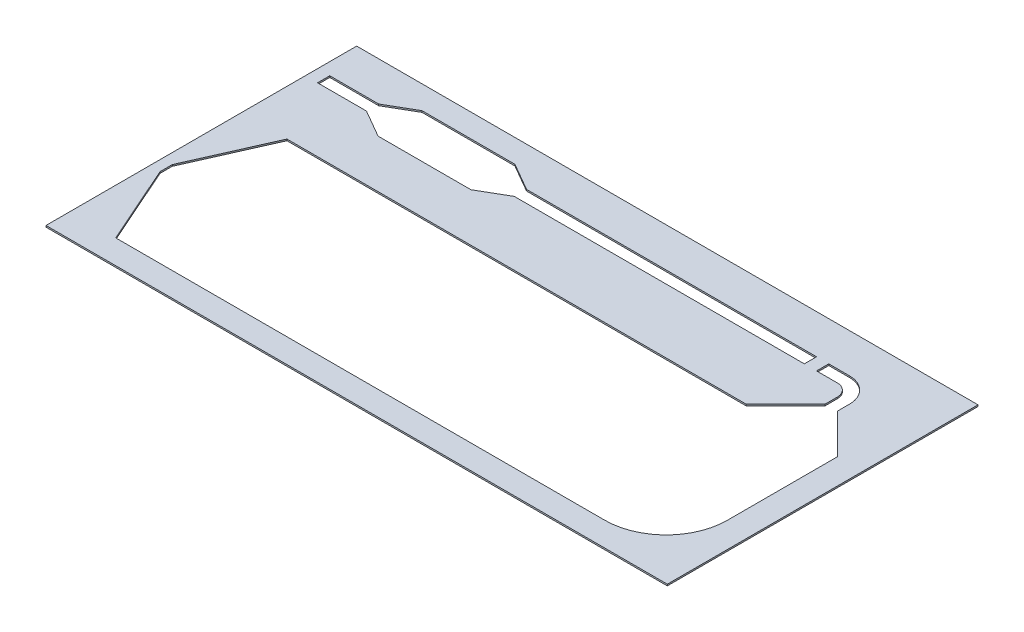
ISO-10303-21;
HEADER;
FILE_DESCRIPTION(('STEP AP214'),'2;1');
FILE_NAME('part.step','',(''),(''),'','','');
FILE_SCHEMA(('AUTOMOTIVE_DESIGN { 1 0 10303 214 1 1 1 1 }'));
ENDSEC;
DATA;
#1=APPLICATION_CONTEXT('core data for automotive mechanical design processes');
#2=APPLICATION_PROTOCOL_DEFINITION('international standard','automotive_design',2000,#1);
#3=PRODUCT_CONTEXT('',#1,'mechanical');
#4=PRODUCT('Part','Part','',(#3));
#5=PRODUCT_RELATED_PRODUCT_CATEGORY('part','',(#4));
#6=PRODUCT_DEFINITION_FORMATION('','',#4);
#7=PRODUCT_DEFINITION_CONTEXT('part definition',#1,'design');
#8=PRODUCT_DEFINITION('design','',#6,#7);
#9=PRODUCT_DEFINITION_SHAPE('','',#8);
#10=(LENGTH_UNIT() NAMED_UNIT(*) SI_UNIT(.MILLI.,.METRE.));
#11=(NAMED_UNIT(*) PLANE_ANGLE_UNIT() SI_UNIT($,.RADIAN.));
#12=(NAMED_UNIT(*) SI_UNIT($,.STERADIAN.) SOLID_ANGLE_UNIT());
#13=UNCERTAINTY_MEASURE_WITH_UNIT(LENGTH_MEASURE(1.E-05),#10,'distance_accuracy_value','');
#14=(GEOMETRIC_REPRESENTATION_CONTEXT(3) GLOBAL_UNCERTAINTY_ASSIGNED_CONTEXT((#13)) GLOBAL_UNIT_ASSIGNED_CONTEXT((#10,
#11,#12)) REPRESENTATION_CONTEXT('',''));
#15=CARTESIAN_POINT('',(0.,0.,0.));
#16=DIRECTION('',(0.,0.,1.));
#17=DIRECTION('',(1.,0.,0.));
#18=AXIS2_PLACEMENT_3D('',#15,#16,#17);
#19=CARTESIAN_POINT('',(77.9571332307417,-1.875,-8.49999999999999));
#20=DIRECTION('',(0.,0.,1.));
#21=DIRECTION('',(-1.,0.,0.));
#22=AXIS2_PLACEMENT_3D('',#19,#20,#21);
#23=PLANE('',#22);
#24=DIRECTION('',(1.,0.,0.));
#25=VECTOR('',#24,1.);
#26=CARTESIAN_POINT('',(86.2671332307417,0.,-8.49999999999999));
#27=LINE('',#26,#25);
#28=CARTESIAN_POINT('',(77.9571332307417,0.,-8.49999999999999));
#29=VERTEX_POINT('',#28);
#30=CARTESIAN_POINT('',(101.667133230742,0.,-8.5));
#31=VERTEX_POINT('',#30);
#32=EDGE_CURVE('E481',#29,#31,#27,.T.);
#33=ORIENTED_EDGE('',*,*,#32,.F.);
#34=DIRECTION('',(0.,1.,0.));
#35=VECTOR('',#34,1.);
#36=CARTESIAN_POINT('',(77.9571332307417,-1.875,-8.49999999999999));
#37=LINE('',#36,#35);
#38=CARTESIAN_POINT('',(77.9571332307417,0.125,-8.49999999999999));
#39=VERTEX_POINT('',#38);
#40=EDGE_CURVE('E363',#29,#39,#37,.T.);
#41=ORIENTED_EDGE('',*,*,#40,.T.);
#42=DIRECTION('',(-1.,0.,0.));
#43=VECTOR('',#42,1.);
#44=CARTESIAN_POINT('',(77.9571332307417,0.125,-8.49999999999999));
#45=LINE('',#44,#43);
#46=CARTESIAN_POINT('',(101.667133230742,0.125,-8.5));
#47=VERTEX_POINT('',#46);
#48=EDGE_CURVE('E329',#47,#39,#45,.T.);
#49=ORIENTED_EDGE('',*,*,#48,.F.);
#50=DIRECTION('',(0.,1.,0.));
#51=VECTOR('',#50,1.);
#52=CARTESIAN_POINT('',(101.667133230742,0.,-8.5));
#53=LINE('',#52,#51);
#54=EDGE_CURVE('E278',#31,#47,#53,.T.);
#55=ORIENTED_EDGE('',*,*,#54,.F.);
#56=EDGE_LOOP('',(#33,#41,#49,#55));
#57=FACE_BOUND('',#56,.T.);
#58=ADVANCED_FACE('F39',(#57),#23,.F.);
#59=CARTESIAN_POINT('',(77.9571332307417,-1.875,-9.5));
#60=DIRECTION('',(0.,0.,-1.));
#61=DIRECTION('',(1.,0.,0.));
#62=AXIS2_PLACEMENT_3D('',#59,#60,#61);
#63=PLANE('',#62);
#64=DIRECTION('',(1.,0.,0.));
#65=VECTOR('',#64,1.);
#66=CARTESIAN_POINT('',(77.9571332307417,0.125,-9.5));
#67=LINE('',#66,#65);
#68=CARTESIAN_POINT('',(77.9571332307417,0.125,-9.5));
#69=VERTEX_POINT('',#68);
#70=CARTESIAN_POINT('',(101.667133230742,0.125,-9.5));
#71=VERTEX_POINT('',#70);
#72=EDGE_CURVE('E264',#69,#71,#67,.T.);
#73=ORIENTED_EDGE('',*,*,#72,.F.);
#74=DIRECTION('',(0.,1.,0.));
#75=VECTOR('',#74,1.);
#76=CARTESIAN_POINT('',(77.9571332307417,-1.875,-9.5));
#77=LINE('',#76,#75);
#78=CARTESIAN_POINT('',(77.9571332307417,0.,-9.5));
#79=VERTEX_POINT('',#78);
#80=EDGE_CURVE('E393',#79,#69,#77,.T.);
#81=ORIENTED_EDGE('',*,*,#80,.F.);
#82=DIRECTION('',(-1.,0.,0.));
#83=VECTOR('',#82,1.);
#84=CARTESIAN_POINT('',(86.2671332307417,0.,-9.5));
#85=LINE('',#84,#83);
#86=CARTESIAN_POINT('',(101.667133230742,0.,-9.5));
#87=VERTEX_POINT('',#86);
#88=EDGE_CURVE('E438',#87,#79,#85,.T.);
#89=ORIENTED_EDGE('',*,*,#88,.F.);
#90=DIRECTION('',(0.,1.,0.));
#91=VECTOR('',#90,1.);
#92=CARTESIAN_POINT('',(101.667133230742,0.,-9.5));
#93=LINE('',#92,#91);
#94=EDGE_CURVE('E255',#87,#71,#93,.T.);
#95=ORIENTED_EDGE('',*,*,#94,.T.);
#96=EDGE_LOOP('',(#73,#81,#89,#95));
#97=FACE_BOUND('',#96,.T.);
#98=ADVANCED_FACE('F540',(#97),#63,.F.);
#99=CARTESIAN_POINT('',(111.667133230742,0.125,-12.7));
#100=DIRECTION('',(-1.,0.,0.));
#101=DIRECTION('',(0.,0.,-1.));
#102=AXIS2_PLACEMENT_3D('',#99,#100,#101);
#103=PLANE('',#102);
#104=DIRECTION('',(0.,0.,1.));
#105=VECTOR('',#104,1.);
#106=CARTESIAN_POINT('',(111.667133230742,0.,-12.7));
#107=LINE('',#106,#105);
#108=CARTESIAN_POINT('',(111.667133230742,0.,-12.7));
#109=VERTEX_POINT('',#108);
#110=CARTESIAN_POINT('',(111.667133230742,0.,12.7));
#111=VERTEX_POINT('',#110);
#112=EDGE_CURVE('E352',#109,#111,#107,.T.);
#113=ORIENTED_EDGE('',*,*,#112,.F.);
#114=DIRECTION('',(0.,-1.,0.));
#115=VECTOR('',#114,1.);
#116=CARTESIAN_POINT('',(111.667133230742,0.125,-12.7));
#117=LINE('',#116,#115);
#118=CARTESIAN_POINT('',(111.667133230742,0.125,-12.7));
#119=VERTEX_POINT('',#118);
#120=EDGE_CURVE('E411',#119,#109,#117,.T.);
#121=ORIENTED_EDGE('',*,*,#120,.F.);
#122=DIRECTION('',(0.,0.,1.));
#123=VECTOR('',#122,1.);
#124=CARTESIAN_POINT('',(111.667133230742,0.125,-12.7));
#125=LINE('',#124,#123);
#126=CARTESIAN_POINT('',(111.667133230742,0.125,12.7));
#127=VERTEX_POINT('',#126);
#128=EDGE_CURVE('E399',#119,#127,#125,.T.);
#129=ORIENTED_EDGE('',*,*,#128,.T.);
#130=DIRECTION('',(0.,-1.,0.));
#131=VECTOR('',#130,1.);
#132=CARTESIAN_POINT('',(111.667133230742,0.125,12.7));
#133=LINE('',#132,#131);
#134=EDGE_CURVE('E429',#127,#111,#133,.T.);
#135=ORIENTED_EDGE('',*,*,#134,.T.);
#136=EDGE_LOOP('',(#113,#121,#129,#135));
#137=FACE_BOUND('',#136,.T.);
#138=ADVANCED_FACE('F41',(#137),#103,.F.);
#139=CARTESIAN_POINT('',(60.8671332307417,0.125,12.7));
#140=DIRECTION('',(0.,0.,-1.));
#141=DIRECTION('',(1.,0.,0.));
#142=AXIS2_PLACEMENT_3D('',#139,#140,#141);
#143=PLANE('',#142);
#144=DIRECTION('',(-1.,0.,0.));
#145=VECTOR('',#144,1.);
#146=CARTESIAN_POINT('',(60.8671332307417,0.,12.7));
#147=LINE('',#146,#145);
#148=CARTESIAN_POINT('',(60.8671332307417,0.,12.7));
#149=VERTEX_POINT('',#148);
#150=EDGE_CURVE('E414',#111,#149,#147,.T.);
#151=ORIENTED_EDGE('',*,*,#150,.F.);
#152=ORIENTED_EDGE('',*,*,#134,.F.);
#153=DIRECTION('',(-1.,0.,0.));
#154=VECTOR('',#153,1.);
#155=CARTESIAN_POINT('',(60.8671332307417,0.125,12.7));
#156=LINE('',#155,#154);
#157=CARTESIAN_POINT('',(60.8671332307417,0.125,12.7));
#158=VERTEX_POINT('',#157);
#159=EDGE_CURVE('E402',#127,#158,#156,.T.);
#160=ORIENTED_EDGE('',*,*,#159,.T.);
#161=DIRECTION('',(0.,-1.,0.));
#162=VECTOR('',#161,1.);
#163=CARTESIAN_POINT('',(60.8671332307417,0.125,12.7));
#164=LINE('',#163,#162);
#165=EDGE_CURVE('E426',#158,#149,#164,.T.);
#166=ORIENTED_EDGE('',*,*,#165,.T.);
#167=EDGE_LOOP('',(#151,#152,#160,#166));
#168=FACE_BOUND('',#167,.T.);
#169=ADVANCED_FACE('F853',(#168),#143,.F.);
#170=CARTESIAN_POINT('',(60.8671332307417,0.125,-12.7));
#171=DIRECTION('',(1.,0.,0.));
#172=DIRECTION('',(0.,0.,1.));
#173=AXIS2_PLACEMENT_3D('',#170,#171,#172);
#174=PLANE('',#173);
#175=DIRECTION('',(0.,0.,-1.));
#176=VECTOR('',#175,1.);
#177=CARTESIAN_POINT('',(60.8671332307417,0.,-12.7));
#178=LINE('',#177,#176);
#179=CARTESIAN_POINT('',(60.8671332307417,0.,-12.7));
#180=VERTEX_POINT('',#179);
#181=EDGE_CURVE('E417',#149,#180,#178,.T.);
#182=ORIENTED_EDGE('',*,*,#181,.F.);
#183=ORIENTED_EDGE('',*,*,#165,.F.);
#184=DIRECTION('',(0.,0.,-1.));
#185=VECTOR('',#184,1.);
#186=CARTESIAN_POINT('',(60.8671332307417,0.125,-12.7));
#187=LINE('',#186,#185);
#188=CARTESIAN_POINT('',(60.8671332307417,0.125,-12.7));
#189=VERTEX_POINT('',#188);
#190=EDGE_CURVE('E406',#158,#189,#187,.T.);
#191=ORIENTED_EDGE('',*,*,#190,.T.);
#192=DIRECTION('',(0.,-1.,0.));
#193=VECTOR('',#192,1.);
#194=CARTESIAN_POINT('',(60.8671332307417,0.125,-12.7));
#195=LINE('',#194,#193);
#196=EDGE_CURVE('E423',#189,#180,#195,.T.);
#197=ORIENTED_EDGE('',*,*,#196,.T.);
#198=EDGE_LOOP('',(#182,#183,#191,#197));
#199=FACE_BOUND('',#198,.T.);
#200=ADVANCED_FACE('F559',(#199),#174,.F.);
#201=CARTESIAN_POINT('',(60.8671332307417,0.125,-12.7));
#202=DIRECTION('',(0.,0.,1.));
#203=DIRECTION('',(-1.,0.,0.));
#204=AXIS2_PLACEMENT_3D('',#201,#202,#203);
#205=PLANE('',#204);
#206=DIRECTION('',(1.,0.,0.));
#207=VECTOR('',#206,1.);
#208=CARTESIAN_POINT('',(60.8671332307417,0.,-12.7));
#209=LINE('',#208,#207);
#210=EDGE_CURVE('E403',#180,#109,#209,.T.);
#211=ORIENTED_EDGE('',*,*,#210,.F.);
#212=ORIENTED_EDGE('',*,*,#196,.F.);
#213=DIRECTION('',(1.,0.,0.));
#214=VECTOR('',#213,1.);
#215=CARTESIAN_POINT('',(60.8671332307417,0.125,-12.7));
#216=LINE('',#215,#214);
#217=EDGE_CURVE('E409',#189,#119,#216,.T.);
#218=ORIENTED_EDGE('',*,*,#217,.T.);
#219=ORIENTED_EDGE('',*,*,#120,.T.);
#220=EDGE_LOOP('',(#211,#212,#218,#219));
#221=FACE_BOUND('',#220,.T.);
#222=ADVANCED_FACE('F552',(#221),#205,.F.);
#223=CARTESIAN_POINT('',(86.2671332307417,0.125,0.));
#224=DIRECTION('',(0.,-1.,0.));
#225=DIRECTION('',(0.,0.,-1.));
#226=AXIS2_PLACEMENT_3D('',#223,#224,#225);
#227=PLANE('',#226);
#228=ORIENTED_EDGE('',*,*,#48,.T.);
#229=DIRECTION('',(-0.865865073244552,0.,0.500277597874626));
#230=VECTOR('',#229,1.);
#231=CARTESIAN_POINT('',(75.7071332307417,0.125,-7.19999999999999));
#232=LINE('',#231,#230);
#233=CARTESIAN_POINT('',(75.7071332307417,0.125,-7.19999999999999));
#234=VERTEX_POINT('',#233);
#235=EDGE_CURVE('E331',#39,#234,#232,.T.);
#236=ORIENTED_EDGE('',*,*,#235,.T.);
#237=DIRECTION('',(-1.,0.,0.));
#238=VECTOR('',#237,1.);
#239=CARTESIAN_POINT('',(68.1171332307417,0.125,-7.2));
#240=LINE('',#239,#238);
#241=CARTESIAN_POINT('',(68.1171332307417,0.125,-7.2));
#242=VERTEX_POINT('',#241);
#243=EDGE_CURVE('E334',#234,#242,#240,.T.);
#244=ORIENTED_EDGE('',*,*,#243,.T.);
#245=DIRECTION('',(-0.865865073244551,0.,-0.500277597874628));
#246=VECTOR('',#245,1.);
#247=CARTESIAN_POINT('',(68.1171332307417,0.125,-7.2));
#248=LINE('',#247,#246);
#249=CARTESIAN_POINT('',(65.8671332307417,0.125,-8.49999999999999));
#250=VERTEX_POINT('',#249);
#251=EDGE_CURVE('E337',#242,#250,#248,.T.);
#252=ORIENTED_EDGE('',*,*,#251,.T.);
#253=DIRECTION('',(-1.,0.,0.));
#254=VECTOR('',#253,1.);
#255=CARTESIAN_POINT('',(65.8671332307417,0.125,-8.49999999999999));
#256=LINE('',#255,#254);
#257=CARTESIAN_POINT('',(61.8671332307417,0.125,-8.49999999999999));
#258=VERTEX_POINT('',#257);
#259=EDGE_CURVE('E340',#250,#258,#256,.T.);
#260=ORIENTED_EDGE('',*,*,#259,.T.);
#261=DIRECTION('',(0.,0.,-1.));
#262=VECTOR('',#261,1.);
#263=CARTESIAN_POINT('',(61.8671332307417,0.125,-9.49999999999999));
#264=LINE('',#263,#262);
#265=CARTESIAN_POINT('',(61.8671332307417,0.125,-9.49999999999999));
#266=VERTEX_POINT('',#265);
#267=EDGE_CURVE('E343',#258,#266,#264,.T.);
#268=ORIENTED_EDGE('',*,*,#267,.T.);
#269=DIRECTION('',(1.,0.,0.));
#270=VECTOR('',#269,1.);
#271=CARTESIAN_POINT('',(65.8671332307417,0.125,-9.49999999999999));
#272=LINE('',#271,#270);
#273=CARTESIAN_POINT('',(65.8671332307417,0.125,-9.49999999999999));
#274=VERTEX_POINT('',#273);
#275=EDGE_CURVE('E346',#266,#274,#272,.T.);
#276=ORIENTED_EDGE('',*,*,#275,.T.);
#277=DIRECTION('',(0.86586507324455,0.,-0.50027759787463));
#278=VECTOR('',#277,1.);
#279=CARTESIAN_POINT('',(68.1171332307417,0.125,-10.8));
#280=LINE('',#279,#278);
#281=CARTESIAN_POINT('',(68.1171332307417,0.125,-10.8));
#282=VERTEX_POINT('',#281);
#283=EDGE_CURVE('E281',#274,#282,#280,.T.);
#284=ORIENTED_EDGE('',*,*,#283,.T.);
#285=DIRECTION('',(1.,0.,0.));
#286=VECTOR('',#285,1.);
#287=CARTESIAN_POINT('',(68.1171332307417,0.125,-10.8));
#288=LINE('',#287,#286);
#289=CARTESIAN_POINT('',(75.7071332307417,0.125,-10.8));
#290=VERTEX_POINT('',#289);
#291=EDGE_CURVE('E287',#282,#290,#288,.T.);
#292=ORIENTED_EDGE('',*,*,#291,.T.);
#293=DIRECTION('',(0.865865073244553,0.,0.500277597874625));
#294=VECTOR('',#293,1.);
#295=CARTESIAN_POINT('',(75.7071332307417,0.125,-10.8));
#296=LINE('',#295,#294);
#297=EDGE_CURVE('E265',#290,#69,#296,.T.);
#298=ORIENTED_EDGE('',*,*,#297,.T.);
#299=ORIENTED_EDGE('',*,*,#72,.T.);
#300=DIRECTION('',(0.,0.,-1.));
#301=VECTOR('',#300,1.);
#302=CARTESIAN_POINT('',(101.667133230742,0.125,-9.5));
#303=LINE('',#302,#301);
#304=EDGE_CURVE('E272',#47,#71,#303,.T.);
#305=ORIENTED_EDGE('',*,*,#304,.F.);
#306=EDGE_LOOP('',(#228,#236,#244,#252,#260,#268,#276,#284,#292,#298,#299,#305));
#307=FACE_BOUND('',#306,.T.);
#308=DIRECTION('',(0.,0.,1.));
#309=VECTOR('',#308,1.);
#310=CARTESIAN_POINT('',(102.667133230742,0.125,-9.5));
#311=LINE('',#310,#309);
#312=CARTESIAN_POINT('',(102.667133230742,0.125,-9.5));
#313=VERTEX_POINT('',#312);
#314=CARTESIAN_POINT('',(102.667133230742,0.125,-8.5));
#315=VERTEX_POINT('',#314);
#316=EDGE_CURVE('E250',#313,#315,#311,.T.);
#317=ORIENTED_EDGE('',*,*,#316,.F.);
#318=CARTESIAN_POINT('',(104.367133230742,0.125,-9.5));
#319=VERTEX_POINT('',#318);
#320=EDGE_CURVE('E258',#313,#319,#67,.T.);
#321=ORIENTED_EDGE('',*,*,#320,.T.);
#322=CARTESIAN_POINT('',(104.367133230742,0.125,-7.5));
#323=DIRECTION('',(0.,-1.,0.));
#324=DIRECTION('',(0.,0.,1.));
#325=AXIS2_PLACEMENT_3D('',#322,#323,#324);
#326=CIRCLE('',#325,2.);
#327=CARTESIAN_POINT('',(106.367133230742,0.125,-7.49999999999998));
#328=VERTEX_POINT('',#327);
#329=EDGE_CURVE('E292',#319,#328,#326,.T.);
#330=ORIENTED_EDGE('',*,*,#329,.T.);
#331=DIRECTION('',(0.,0.,1.));
#332=VECTOR('',#331,1.);
#333=CARTESIAN_POINT('',(106.367133230742,0.125,-7.49999999999998));
#334=LINE('',#333,#332);
#335=CARTESIAN_POINT('',(106.367133230742,0.125,-6.5));
#336=VERTEX_POINT('',#335);
#337=EDGE_CURVE('E294',#328,#336,#334,.T.);
#338=ORIENTED_EDGE('',*,*,#337,.T.);
#339=DIRECTION('',(0.707106781186547,0.,0.707106781186548));
#340=VECTOR('',#339,1.);
#341=CARTESIAN_POINT('',(106.367133230742,0.125,-6.5));
#342=LINE('',#341,#340);
#343=CARTESIAN_POINT('',(109.597413718749,0.125,-3.26971951199276));
#344=VERTEX_POINT('',#343);
#345=EDGE_CURVE('E297',#336,#344,#342,.T.);
#346=ORIENTED_EDGE('',*,*,#345,.T.);
#347=DIRECTION('',(0.,0.,1.));
#348=VECTOR('',#347,1.);
#349=CARTESIAN_POINT('',(109.597413718749,0.125,-3.26971951199276));
#350=LINE('',#349,#348);
#351=CARTESIAN_POINT('',(109.597413718749,0.125,5.7302804880072));
#352=VERTEX_POINT('',#351);
#353=EDGE_CURVE('E300',#344,#352,#350,.T.);
#354=ORIENTED_EDGE('',*,*,#353,.T.);
#355=CARTESIAN_POINT('',(104.597413718749,0.125,5.73028048800724));
#356=DIRECTION('',(0.,-1.,0.));
#357=DIRECTION('',(0.,0.,-1.));
#358=AXIS2_PLACEMENT_3D('',#355,#356,#357);
#359=CIRCLE('',#358,5.);
#360=CARTESIAN_POINT('',(104.597413718749,0.125,10.7302804880072));
#361=VERTEX_POINT('',#360);
#362=EDGE_CURVE('E303',#352,#361,#359,.T.);
#363=ORIENTED_EDGE('',*,*,#362,.T.);
#364=DIRECTION('',(-1.,0.,0.));
#365=VECTOR('',#364,1.);
#366=CARTESIAN_POINT('',(104.597413718749,0.125,10.7302804880072));
#367=LINE('',#366,#365);
#368=CARTESIAN_POINT('',(64.597413718749,0.125,10.7302804880072));
#369=VERTEX_POINT('',#368);
#370=EDGE_CURVE('E306',#361,#369,#367,.T.);
#371=ORIENTED_EDGE('',*,*,#370,.T.);
#372=DIRECTION('',(-0.404797287724746,0.,-0.914406450026841));
#373=VECTOR('',#372,1.);
#374=CARTESIAN_POINT('',(64.597413718749,0.125,10.7302804880072));
#375=LINE('',#374,#373);
#376=CARTESIAN_POINT('',(61.7199379855741,0.125,4.23028048800724));
#377=VERTEX_POINT('',#376);
#378=EDGE_CURVE('E309',#369,#377,#375,.T.);
#379=ORIENTED_EDGE('',*,*,#378,.T.);
#380=DIRECTION('',(0.,0.,-1.));
#381=VECTOR('',#380,1.);
#382=CARTESIAN_POINT('',(61.7199379855741,0.125,4.23028048800724));
#383=LINE('',#382,#381);
#384=CARTESIAN_POINT('',(61.7199379855741,0.125,3.23028048800733));
#385=VERTEX_POINT('',#384);
#386=EDGE_CURVE('E312',#377,#385,#383,.T.);
#387=ORIENTED_EDGE('',*,*,#386,.T.);
#388=DIRECTION('',(0.404797287724746,0.,-0.914406450026841));
#389=VECTOR('',#388,1.);
#390=CARTESIAN_POINT('',(64.597413718749,0.125,-3.26971951199267));
#391=LINE('',#390,#389);
#392=CARTESIAN_POINT('',(64.597413718749,0.125,-3.26971951199267));
#393=VERTEX_POINT('',#392);
#394=EDGE_CURVE('E315',#385,#393,#391,.T.);
#395=ORIENTED_EDGE('',*,*,#394,.T.);
#396=DIRECTION('',(1.,0.,0.));
#397=VECTOR('',#396,1.);
#398=CARTESIAN_POINT('',(102.136852742734,0.125,-3.26971951199267));
#399=LINE('',#398,#397);
#400=CARTESIAN_POINT('',(102.136852742734,0.125,-3.26971951199267));
#401=VERTEX_POINT('',#400);
#402=EDGE_CURVE('E318',#393,#401,#399,.T.);
#403=ORIENTED_EDGE('',*,*,#402,.T.);
#404=DIRECTION('',(0.707106781186547,0.,-0.707106781186547));
#405=VECTOR('',#404,1.);
#406=CARTESIAN_POINT('',(105.367133230742,0.125,-6.5));
#407=LINE('',#406,#405);
#408=CARTESIAN_POINT('',(105.367133230742,0.125,-6.5));
#409=VERTEX_POINT('',#408);
#410=EDGE_CURVE('E321',#401,#409,#407,.T.);
#411=ORIENTED_EDGE('',*,*,#410,.T.);
#412=DIRECTION('',(0.,0.,-1.));
#413=VECTOR('',#412,1.);
#414=CARTESIAN_POINT('',(105.367133230742,0.125,-7.49999999999999));
#415=LINE('',#414,#413);
#416=CARTESIAN_POINT('',(105.367133230742,0.125,-7.49999999999999));
#417=VERTEX_POINT('',#416);
#418=EDGE_CURVE('E324',#409,#417,#415,.T.);
#419=ORIENTED_EDGE('',*,*,#418,.T.);
#420=CARTESIAN_POINT('',(104.367133230742,0.125,-7.5));
#421=DIRECTION('',(0.,1.,0.));
#422=DIRECTION('',(0.,0.,1.));
#423=AXIS2_PLACEMENT_3D('',#420,#421,#422);
#424=CIRCLE('',#423,0.999999999999999);
#425=CARTESIAN_POINT('',(104.367133230742,0.125,-8.5));
#426=VERTEX_POINT('',#425);
#427=EDGE_CURVE('E327',#417,#426,#424,.T.);
#428=ORIENTED_EDGE('',*,*,#427,.T.);
#429=EDGE_CURVE('E270',#426,#315,#45,.T.);
#430=ORIENTED_EDGE('',*,*,#429,.T.);
#431=EDGE_LOOP('',(#317,#321,#330,#338,#346,#354,#363,#371,#379,#387,#395,#403,#411,#419,#428,#430));
#432=FACE_BOUND('',#431,.T.);
#433=ORIENTED_EDGE('',*,*,#128,.F.);
#434=ORIENTED_EDGE('',*,*,#217,.F.);
#435=ORIENTED_EDGE('',*,*,#190,.F.);
#436=ORIENTED_EDGE('',*,*,#159,.F.);
#437=EDGE_LOOP('',(#433,#434,#435,#436));
#438=FACE_BOUND('',#437,.T.);
#439=ADVANCED_FACE('F267',(#307,#432,#438),#227,.F.);
#440=CARTESIAN_POINT('',(86.2671332307417,0.,0.));
#441=DIRECTION('',(0.,-1.,0.));
#442=DIRECTION('',(0.,0.,-1.));
#443=AXIS2_PLACEMENT_3D('',#440,#441,#442);
#444=PLANE('',#443);
#445=DIRECTION('',(0.,0.,-1.));
#446=VECTOR('',#445,1.);
#447=CARTESIAN_POINT('',(101.667133230742,0.,-9.5));
#448=LINE('',#447,#446);
#449=EDGE_CURVE('E271',#31,#87,#448,.T.);
#450=ORIENTED_EDGE('',*,*,#449,.T.);
#451=ORIENTED_EDGE('',*,*,#88,.T.);
#452=DIRECTION('',(-0.865865073244553,0.,-0.500277597874626));
#453=VECTOR('',#452,1.);
#454=CARTESIAN_POINT('',(88.3024682918302,0.,-3.52269529803782));
#455=LINE('',#454,#453);
#456=CARTESIAN_POINT('',(75.7071332307417,0.,-10.8));
#457=VERTEX_POINT('',#456);
#458=EDGE_CURVE('E435',#79,#457,#455,.T.);
#459=ORIENTED_EDGE('',*,*,#458,.T.);
#460=DIRECTION('',(-1.,0.,0.));
#461=VECTOR('',#460,1.);
#462=CARTESIAN_POINT('',(86.2671332307417,0.,-10.8));
#463=LINE('',#462,#461);
#464=CARTESIAN_POINT('',(68.1171332307417,0.,-10.8));
#465=VERTEX_POINT('',#464);
#466=EDGE_CURVE('E432',#457,#465,#463,.T.);
#467=ORIENTED_EDGE('',*,*,#466,.T.);
#468=DIRECTION('',(-0.86586507324455,0.,0.50027759787463));
#469=VECTOR('',#468,1.);
#470=CARTESIAN_POINT('',(77.0463261222634,0.,-15.9590892262125));
#471=LINE('',#470,#469);
#472=CARTESIAN_POINT('',(65.8671332307417,0.,-9.49999999999999));
#473=VERTEX_POINT('',#472);
#474=EDGE_CURVE('E11',#465,#473,#471,.T.);
#475=ORIENTED_EDGE('',*,*,#474,.T.);
#476=DIRECTION('',(-1.,0.,0.));
#477=VECTOR('',#476,1.);
#478=CARTESIAN_POINT('',(86.2671332307417,0.,-9.49999999999999));
#479=LINE('',#478,#477);
#480=CARTESIAN_POINT('',(61.8671332307417,0.,-9.49999999999999));
#481=VERTEX_POINT('',#480);
#482=EDGE_CURVE('E47',#473,#481,#479,.T.);
#483=ORIENTED_EDGE('',*,*,#482,.T.);
#484=DIRECTION('',(0.,0.,1.));
#485=VECTOR('',#484,1.);
#486=CARTESIAN_POINT('',(61.8671332307417,0.,0.));
#487=LINE('',#486,#485);
#488=CARTESIAN_POINT('',(61.8671332307417,0.,-8.49999999999999));
#489=VERTEX_POINT('',#488);
#490=EDGE_CURVE('E495',#481,#489,#487,.T.);
#491=ORIENTED_EDGE('',*,*,#490,.T.);
#492=DIRECTION('',(1.,0.,0.));
#493=VECTOR('',#492,1.);
#494=CARTESIAN_POINT('',(86.2671332307417,0.,-8.49999999999998));
#495=LINE('',#494,#493);
#496=CARTESIAN_POINT('',(65.8671332307417,0.,-8.49999999999999));
#497=VERTEX_POINT('',#496);
#498=EDGE_CURVE('E492',#489,#497,#495,.T.);
#499=ORIENTED_EDGE('',*,*,#498,.T.);
#500=DIRECTION('',(0.865865073244551,0.,0.500277597874628));
#501=VECTOR('',#500,1.);
#502=CARTESIAN_POINT('',(84.8434383029372,0.,2.46408737504627));
#503=LINE('',#502,#501);
#504=CARTESIAN_POINT('',(68.1171332307417,0.,-7.2));
#505=VERTEX_POINT('',#504);
#506=EDGE_CURVE('E489',#497,#505,#503,.T.);
#507=ORIENTED_EDGE('',*,*,#506,.T.);
#508=DIRECTION('',(1.,0.,0.));
#509=VECTOR('',#508,1.);
#510=CARTESIAN_POINT('',(86.2671332307417,0.,-7.19999999999999));
#511=LINE('',#510,#509);
#512=CARTESIAN_POINT('',(75.7071332307417,0.,-7.19999999999999));
#513=VERTEX_POINT('',#512);
#514=EDGE_CURVE('E486',#505,#513,#511,.T.);
#515=ORIENTED_EDGE('',*,*,#514,.T.);
#516=DIRECTION('',(0.865865073244552,0.,-0.500277597874626));
#517=VECTOR('',#516,1.);
#518=CARTESIAN_POINT('',(80.5053561111564,0.,-9.97230655312847));
#519=LINE('',#518,#517);
#520=EDGE_CURVE('E484',#513,#29,#519,.T.);
#521=ORIENTED_EDGE('',*,*,#520,.T.);
#522=ORIENTED_EDGE('',*,*,#32,.T.);
#523=EDGE_LOOP('',(#450,#451,#459,#467,#475,#483,#491,#499,#507,#515,#521,#522));
#524=FACE_BOUND('',#523,.T.);
#525=CARTESIAN_POINT('',(102.667133230742,0.,-8.5));
#526=VERTEX_POINT('',#525);
#527=CARTESIAN_POINT('',(104.367133230742,0.,-8.5));
#528=VERTEX_POINT('',#527);
#529=EDGE_CURVE('E480',#526,#528,#27,.T.);
#530=ORIENTED_EDGE('',*,*,#529,.T.);
#531=CARTESIAN_POINT('',(104.367133230742,0.,-7.5));
#532=DIRECTION('',(0.,1.,0.));
#533=DIRECTION('',(0.,0.,-1.));
#534=AXIS2_PLACEMENT_3D('',#531,#532,#533);
#535=CIRCLE('',#534,0.999999999999999);
#536=CARTESIAN_POINT('',(105.367133230742,0.,-7.49999999999999));
#537=VERTEX_POINT('',#536);
#538=EDGE_CURVE('E477',#528,#537,#535,.F.);
#539=ORIENTED_EDGE('',*,*,#538,.T.);
#540=DIRECTION('',(0.,0.,1.));
#541=VECTOR('',#540,1.);
#542=CARTESIAN_POINT('',(105.367133230742,0.,0.));
#543=LINE('',#542,#541);
#544=CARTESIAN_POINT('',(105.367133230742,0.,-6.5));
#545=VERTEX_POINT('',#544);
#546=EDGE_CURVE('E474',#537,#545,#543,.T.);
#547=ORIENTED_EDGE('',*,*,#546,.T.);
#548=DIRECTION('',(-0.707106781186548,0.,0.707106781186548));
#549=VECTOR('',#548,1.);
#550=CARTESIAN_POINT('',(92.5671332307417,0.,6.3));
#551=LINE('',#550,#549);
#552=CARTESIAN_POINT('',(102.136852742734,0.,-3.26971951199267));
#553=VERTEX_POINT('',#552);
#554=EDGE_CURVE('E471',#545,#553,#551,.T.);
#555=ORIENTED_EDGE('',*,*,#554,.T.);
#556=DIRECTION('',(-1.,0.,0.));
#557=VECTOR('',#556,1.);
#558=CARTESIAN_POINT('',(86.2671332307417,0.,-3.26971951199267));
#559=LINE('',#558,#557);
#560=CARTESIAN_POINT('',(64.597413718749,0.,-3.26971951199267));
#561=VERTEX_POINT('',#560);
#562=EDGE_CURVE('E468',#553,#561,#559,.T.);
#563=ORIENTED_EDGE('',*,*,#562,.T.);
#564=DIRECTION('',(-0.404797287724746,0.,0.914406450026841));
#565=VECTOR('',#564,1.);
#566=CARTESIAN_POINT('',(66.9379480226128,0.,-8.55680944283604));
#567=LINE('',#566,#565);
#568=CARTESIAN_POINT('',(61.7199379855741,0.,3.23028048800733));
#569=VERTEX_POINT('',#568);
#570=EDGE_CURVE('E465',#561,#569,#567,.T.);
#571=ORIENTED_EDGE('',*,*,#570,.T.);
#572=DIRECTION('',(0.,0.,1.));
#573=VECTOR('',#572,1.);
#574=CARTESIAN_POINT('',(61.7199379855741,0.,0.));
#575=LINE('',#574,#573);
#576=CARTESIAN_POINT('',(61.7199379855741,0.,4.23028048800724));
#577=VERTEX_POINT('',#576);
#578=EDGE_CURVE('E462',#569,#577,#575,.T.);
#579=ORIENTED_EDGE('',*,*,#578,.T.);
#580=DIRECTION('',(0.404797287724746,0.,0.914406450026841));
#581=VECTOR('',#580,1.);
#582=CARTESIAN_POINT('',(64.1764269664287,0.,9.77930326219319));
#583=LINE('',#582,#581);
#584=CARTESIAN_POINT('',(64.597413718749,0.,10.7302804880072));
#585=VERTEX_POINT('',#584);
#586=EDGE_CURVE('E459',#577,#585,#583,.T.);
#587=ORIENTED_EDGE('',*,*,#586,.T.);
#588=DIRECTION('',(1.,0.,0.));
#589=VECTOR('',#588,1.);
#590=CARTESIAN_POINT('',(86.2671332307417,0.,10.7302804880072));
#591=LINE('',#590,#589);
#592=CARTESIAN_POINT('',(104.597413718749,0.,10.7302804880072));
#593=VERTEX_POINT('',#592);
#594=EDGE_CURVE('E456',#585,#593,#591,.T.);
#595=ORIENTED_EDGE('',*,*,#594,.T.);
#596=CARTESIAN_POINT('',(104.597413718749,0.,5.73028048800724));
#597=DIRECTION('',(0.,1.,0.));
#598=DIRECTION('',(0.,0.,-1.));
#599=AXIS2_PLACEMENT_3D('',#596,#597,#598);
#600=CIRCLE('',#599,5.);
#601=CARTESIAN_POINT('',(109.597413718749,0.,5.7302804880072));
#602=VERTEX_POINT('',#601);
#603=EDGE_CURVE('E453',#593,#602,#600,.T.);
#604=ORIENTED_EDGE('',*,*,#603,.T.);
#605=DIRECTION('',(0.,0.,-1.));
#606=VECTOR('',#605,1.);
#607=CARTESIAN_POINT('',(109.597413718749,0.,0.));
#608=LINE('',#607,#606);
#609=CARTESIAN_POINT('',(109.597413718749,0.,-3.26971951199276));
#610=VERTEX_POINT('',#609);
#611=EDGE_CURVE('E450',#602,#610,#608,.T.);
#612=ORIENTED_EDGE('',*,*,#611,.T.);
#613=DIRECTION('',(-0.707106781186547,0.,-0.707106781186548));
#614=VECTOR('',#613,1.);
#615=CARTESIAN_POINT('',(99.5671332307417,0.,-13.3));
#616=LINE('',#615,#614);
#617=CARTESIAN_POINT('',(106.367133230742,0.,-6.5));
#618=VERTEX_POINT('',#617);
#619=EDGE_CURVE('E447',#610,#618,#616,.T.);
#620=ORIENTED_EDGE('',*,*,#619,.T.);
#621=DIRECTION('',(0.,0.,-1.));
#622=VECTOR('',#621,1.);
#623=CARTESIAN_POINT('',(106.367133230742,0.,0.));
#624=LINE('',#623,#622);
#625=CARTESIAN_POINT('',(106.367133230742,0.,-7.49999999999998));
#626=VERTEX_POINT('',#625);
#627=EDGE_CURVE('E444',#618,#626,#624,.T.);
#628=ORIENTED_EDGE('',*,*,#627,.T.);
#629=CARTESIAN_POINT('',(104.367133230742,0.,-7.5));
#630=DIRECTION('',(0.,1.,0.));
#631=DIRECTION('',(0.,0.,-1.));
#632=AXIS2_PLACEMENT_3D('',#629,#630,#631);
#633=CIRCLE('',#632,2.);
#634=CARTESIAN_POINT('',(104.367133230742,0.,-9.5));
#635=VERTEX_POINT('',#634);
#636=EDGE_CURVE('E441',#626,#635,#633,.T.);
#637=ORIENTED_EDGE('',*,*,#636,.T.);
#638=CARTESIAN_POINT('',(102.667133230742,0.,-9.5));
#639=VERTEX_POINT('',#638);
#640=EDGE_CURVE('E439',#635,#639,#85,.T.);
#641=ORIENTED_EDGE('',*,*,#640,.T.);
#642=DIRECTION('',(0.,0.,1.));
#643=VECTOR('',#642,1.);
#644=CARTESIAN_POINT('',(102.667133230742,0.,-9.5));
#645=LINE('',#644,#643);
#646=EDGE_CURVE('E251',#639,#526,#645,.T.);
#647=ORIENTED_EDGE('',*,*,#646,.T.);
#648=EDGE_LOOP('',(#530,#539,#547,#555,#563,#571,#579,#587,#595,#604,#612,#620,#628,#637,#641,#647));
#649=FACE_BOUND('',#648,.T.);
#650=ORIENTED_EDGE('',*,*,#112,.T.);
#651=ORIENTED_EDGE('',*,*,#150,.T.);
#652=ORIENTED_EDGE('',*,*,#181,.T.);
#653=ORIENTED_EDGE('',*,*,#210,.T.);
#654=EDGE_LOOP('',(#650,#651,#652,#653));
#655=FACE_BOUND('',#654,.T.);
#656=ADVANCED_FACE('F500',(#524,#649,#655),#444,.T.);
#657=CARTESIAN_POINT('',(68.1171332307417,-1.875,-10.8));
#658=DIRECTION('',(-0.50027759787463,0.,-0.86586507324455));
#659=DIRECTION('',(0.86586507324455,0.,-0.50027759787463));
#660=AXIS2_PLACEMENT_3D('',#657,#658,#659);
#661=PLANE('',#660);
#662=ORIENTED_EDGE('',*,*,#474,.F.);
#663=DIRECTION('',(0.,1.,0.));
#664=VECTOR('',#663,1.);
#665=CARTESIAN_POINT('',(68.1171332307417,-1.875,-10.8));
#666=LINE('',#665,#664);
#667=EDGE_CURVE('E349',#465,#282,#666,.T.);
#668=ORIENTED_EDGE('',*,*,#667,.T.);
#669=ORIENTED_EDGE('',*,*,#283,.F.);
#670=DIRECTION('',(0.,1.,0.));
#671=VECTOR('',#670,1.);
#672=CARTESIAN_POINT('',(65.8671332307417,-1.875,-9.49999999999999));
#673=LINE('',#672,#671);
#674=EDGE_CURVE('E350',#473,#274,#673,.T.);
#675=ORIENTED_EDGE('',*,*,#674,.F.);
#676=EDGE_LOOP('',(#662,#668,#669,#675));
#677=FACE_BOUND('',#676,.T.);
#678=ADVANCED_FACE('F549',(#677),#661,.F.);
#679=CARTESIAN_POINT('',(65.8671332307417,-1.875,-9.49999999999999));
#680=DIRECTION('',(0.,0.,-1.));
#681=DIRECTION('',(1.,0.,0.));
#682=AXIS2_PLACEMENT_3D('',#679,#680,#681);
#683=PLANE('',#682);
#684=ORIENTED_EDGE('',*,*,#482,.F.);
#685=ORIENTED_EDGE('',*,*,#674,.T.);
#686=ORIENTED_EDGE('',*,*,#275,.F.);
#687=DIRECTION('',(0.,1.,0.));
#688=VECTOR('',#687,1.);
#689=CARTESIAN_POINT('',(61.8671332307417,-1.875,-9.49999999999999));
#690=LINE('',#689,#688);
#691=EDGE_CURVE('E353',#481,#266,#690,.T.);
#692=ORIENTED_EDGE('',*,*,#691,.F.);
#693=EDGE_LOOP('',(#684,#685,#686,#692));
#694=FACE_BOUND('',#693,.T.);
#695=ADVANCED_FACE('F505',(#694),#683,.F.);
#696=CARTESIAN_POINT('',(61.8671332307417,-1.875,-9.49999999999999));
#697=DIRECTION('',(-1.,0.,0.));
#698=DIRECTION('',(0.,0.,-1.));
#699=AXIS2_PLACEMENT_3D('',#696,#697,#698);
#700=PLANE('',#699);
#701=ORIENTED_EDGE('',*,*,#490,.F.);
#702=ORIENTED_EDGE('',*,*,#691,.T.);
#703=ORIENTED_EDGE('',*,*,#267,.F.);
#704=DIRECTION('',(0.,1.,0.));
#705=VECTOR('',#704,1.);
#706=CARTESIAN_POINT('',(61.8671332307417,-1.875,-8.49999999999999));
#707=LINE('',#706,#705);
#708=EDGE_CURVE('E355',#489,#258,#707,.T.);
#709=ORIENTED_EDGE('',*,*,#708,.F.);
#710=EDGE_LOOP('',(#701,#702,#703,#709));
#711=FACE_BOUND('',#710,.T.);
#712=ADVANCED_FACE('F510',(#711),#700,.F.);
#713=CARTESIAN_POINT('',(65.8671332307417,-1.875,-8.49999999999999));
#714=DIRECTION('',(0.,0.,1.));
#715=DIRECTION('',(-1.,0.,0.));
#716=AXIS2_PLACEMENT_3D('',#713,#714,#715);
#717=PLANE('',#716);
#718=ORIENTED_EDGE('',*,*,#498,.F.);
#719=ORIENTED_EDGE('',*,*,#708,.T.);
#720=ORIENTED_EDGE('',*,*,#259,.F.);
#721=DIRECTION('',(0.,1.,0.));
#722=VECTOR('',#721,1.);
#723=CARTESIAN_POINT('',(65.8671332307417,-1.875,-8.49999999999999));
#724=LINE('',#723,#722);
#725=EDGE_CURVE('E357',#497,#250,#724,.T.);
#726=ORIENTED_EDGE('',*,*,#725,.F.);
#727=EDGE_LOOP('',(#718,#719,#720,#726));
#728=FACE_BOUND('',#727,.T.);
#729=ADVANCED_FACE('F514',(#728),#717,.F.);
#730=CARTESIAN_POINT('',(68.1171332307417,-1.875,-7.2));
#731=DIRECTION('',(-0.500277597874628,0.,0.865865073244551));
#732=DIRECTION('',(-0.865865073244551,0.,-0.500277597874628));
#733=AXIS2_PLACEMENT_3D('',#730,#731,#732);
#734=PLANE('',#733);
#735=ORIENTED_EDGE('',*,*,#506,.F.);
#736=ORIENTED_EDGE('',*,*,#725,.T.);
#737=ORIENTED_EDGE('',*,*,#251,.F.);
#738=DIRECTION('',(0.,1.,0.));
#739=VECTOR('',#738,1.);
#740=CARTESIAN_POINT('',(68.1171332307417,-1.875,-7.2));
#741=LINE('',#740,#739);
#742=EDGE_CURVE('E359',#505,#242,#741,.T.);
#743=ORIENTED_EDGE('',*,*,#742,.F.);
#744=EDGE_LOOP('',(#735,#736,#737,#743));
#745=FACE_BOUND('',#744,.T.);
#746=ADVANCED_FACE('F518',(#745),#734,.F.);
#747=CARTESIAN_POINT('',(68.1171332307417,-1.875,-7.2));
#748=DIRECTION('',(0.,0.,1.));
#749=DIRECTION('',(-1.,0.,0.));
#750=AXIS2_PLACEMENT_3D('',#747,#748,#749);
#751=PLANE('',#750);
#752=ORIENTED_EDGE('',*,*,#514,.F.);
#753=ORIENTED_EDGE('',*,*,#742,.T.);
#754=ORIENTED_EDGE('',*,*,#243,.F.);
#755=DIRECTION('',(0.,1.,0.));
#756=VECTOR('',#755,1.);
#757=CARTESIAN_POINT('',(75.7071332307417,-1.875,-7.19999999999999));
#758=LINE('',#757,#756);
#759=EDGE_CURVE('E361',#513,#234,#758,.T.);
#760=ORIENTED_EDGE('',*,*,#759,.F.);
#761=EDGE_LOOP('',(#752,#753,#754,#760));
#762=FACE_BOUND('',#761,.T.);
#763=ADVANCED_FACE('F522',(#762),#751,.F.);
#764=CARTESIAN_POINT('',(75.7071332307417,-1.875,-7.19999999999999));
#765=DIRECTION('',(0.500277597874626,0.,0.865865073244552));
#766=DIRECTION('',(-0.865865073244552,0.,0.500277597874626));
#767=AXIS2_PLACEMENT_3D('',#764,#765,#766);
#768=PLANE('',#767);
#769=ORIENTED_EDGE('',*,*,#520,.F.);
#770=ORIENTED_EDGE('',*,*,#759,.T.);
#771=ORIENTED_EDGE('',*,*,#235,.F.);
#772=ORIENTED_EDGE('',*,*,#40,.F.);
#773=EDGE_LOOP('',(#769,#770,#771,#772));
#774=FACE_BOUND('',#773,.T.);
#775=ADVANCED_FACE('F526',(#774),#768,.F.);
#776=ORIENTED_EDGE('',*,*,#429,.F.);
#777=DIRECTION('',(0.,1.,0.));
#778=VECTOR('',#777,1.);
#779=CARTESIAN_POINT('',(104.367133230742,-1.875,-8.5));
#780=LINE('',#779,#778);
#781=EDGE_CURVE('E366',#528,#426,#780,.T.);
#782=ORIENTED_EDGE('',*,*,#781,.F.);
#783=ORIENTED_EDGE('',*,*,#529,.F.);
#784=DIRECTION('',(0.,1.,0.));
#785=VECTOR('',#784,1.);
#786=CARTESIAN_POINT('',(102.667133230742,0.,-8.5));
#787=LINE('',#786,#785);
#788=EDGE_CURVE('E54',#526,#315,#787,.T.);
#789=ORIENTED_EDGE('',*,*,#788,.T.);
#790=EDGE_LOOP('',(#776,#782,#783,#789));
#791=FACE_BOUND('',#790,.T.);
#792=ADVANCED_FACE('F565',(#791),#23,.F.);
#793=CARTESIAN_POINT('',(104.367133230742,-1.875,-7.5));
#794=DIRECTION('',(0.,1.,0.));
#795=DIRECTION('',(0.,0.,1.));
#796=AXIS2_PLACEMENT_3D('',#793,#794,#795);
#797=CYLINDRICAL_SURFACE('',#796,0.999999999999999);
#798=ORIENTED_EDGE('',*,*,#538,.F.);
#799=ORIENTED_EDGE('',*,*,#781,.T.);
#800=ORIENTED_EDGE('',*,*,#427,.F.);
#801=DIRECTION('',(0.,1.,0.));
#802=VECTOR('',#801,1.);
#803=CARTESIAN_POINT('',(105.367133230742,-1.875,-7.49999999999999));
#804=LINE('',#803,#802);
#805=EDGE_CURVE('E368',#537,#417,#804,.T.);
#806=ORIENTED_EDGE('',*,*,#805,.F.);
#807=EDGE_LOOP('',(#798,#799,#800,#806));
#808=FACE_BOUND('',#807,.T.);
#809=ADVANCED_FACE('F573',(#808),#797,.T.);
#810=CARTESIAN_POINT('',(105.367133230742,-1.875,-7.49999999999999));
#811=DIRECTION('',(-1.,0.,0.));
#812=DIRECTION('',(0.,0.,-1.));
#813=AXIS2_PLACEMENT_3D('',#810,#811,#812);
#814=PLANE('',#813);
#815=ORIENTED_EDGE('',*,*,#546,.F.);
#816=ORIENTED_EDGE('',*,*,#805,.T.);
#817=ORIENTED_EDGE('',*,*,#418,.F.);
#818=DIRECTION('',(0.,1.,0.));
#819=VECTOR('',#818,1.);
#820=CARTESIAN_POINT('',(105.367133230742,-1.875,-6.5));
#821=LINE('',#820,#819);
#822=EDGE_CURVE('E370',#545,#409,#821,.T.);
#823=ORIENTED_EDGE('',*,*,#822,.F.);
#824=EDGE_LOOP('',(#815,#816,#817,#823));
#825=FACE_BOUND('',#824,.T.);
#826=ADVANCED_FACE('F578',(#825),#814,.F.);
#827=CARTESIAN_POINT('',(105.367133230742,-1.875,-6.5));
#828=DIRECTION('',(-0.707106781186547,0.,-0.707106781186547));
#829=DIRECTION('',(0.707106781186548,0.,-0.707106781186548));
#830=AXIS2_PLACEMENT_3D('',#827,#828,#829);
#831=PLANE('',#830);
#832=ORIENTED_EDGE('',*,*,#554,.F.);
#833=ORIENTED_EDGE('',*,*,#822,.T.);
#834=ORIENTED_EDGE('',*,*,#410,.F.);
#835=DIRECTION('',(0.,1.,0.));
#836=VECTOR('',#835,1.);
#837=CARTESIAN_POINT('',(102.136852742734,-1.875,-3.26971951199267));
#838=LINE('',#837,#836);
#839=EDGE_CURVE('E372',#553,#401,#838,.T.);
#840=ORIENTED_EDGE('',*,*,#839,.F.);
#841=EDGE_LOOP('',(#832,#833,#834,#840));
#842=FACE_BOUND('',#841,.T.);
#843=ADVANCED_FACE('F628',(#842),#831,.F.);
#844=CARTESIAN_POINT('',(102.136852742734,-1.875,-3.26971951199267));
#845=DIRECTION('',(0.,0.,-1.));
#846=DIRECTION('',(1.,0.,0.));
#847=AXIS2_PLACEMENT_3D('',#844,#845,#846);
#848=PLANE('',#847);
#849=ORIENTED_EDGE('',*,*,#562,.F.);
#850=ORIENTED_EDGE('',*,*,#839,.T.);
#851=ORIENTED_EDGE('',*,*,#402,.F.);
#852=DIRECTION('',(0.,1.,0.));
#853=VECTOR('',#852,1.);
#854=CARTESIAN_POINT('',(64.597413718749,-1.875,-3.26971951199267));
#855=LINE('',#854,#853);
#856=EDGE_CURVE('E374',#561,#393,#855,.T.);
#857=ORIENTED_EDGE('',*,*,#856,.F.);
#858=EDGE_LOOP('',(#849,#850,#851,#857));
#859=FACE_BOUND('',#858,.T.);
#860=ADVANCED_FACE('F624',(#859),#848,.F.);
#861=CARTESIAN_POINT('',(64.597413718749,-1.875,-3.26971951199267));
#862=DIRECTION('',(-0.914406450026841,0.,-0.404797287724746));
#863=DIRECTION('',(0.404797287724746,0.,-0.914406450026841));
#864=AXIS2_PLACEMENT_3D('',#861,#862,#863);
#865=PLANE('',#864);
#866=ORIENTED_EDGE('',*,*,#570,.F.);
#867=ORIENTED_EDGE('',*,*,#856,.T.);
#868=ORIENTED_EDGE('',*,*,#394,.F.);
#869=DIRECTION('',(0.,1.,0.));
#870=VECTOR('',#869,1.);
#871=CARTESIAN_POINT('',(61.7199379855741,-1.875,3.23028048800733));
#872=LINE('',#871,#870);
#873=EDGE_CURVE('E376',#569,#385,#872,.T.);
#874=ORIENTED_EDGE('',*,*,#873,.F.);
#875=EDGE_LOOP('',(#866,#867,#868,#874));
#876=FACE_BOUND('',#875,.T.);
#877=ADVANCED_FACE('F620',(#876),#865,.F.);
#878=CARTESIAN_POINT('',(61.7199379855741,-1.875,4.23028048800724));
#879=DIRECTION('',(-1.,0.,0.));
#880=DIRECTION('',(0.,0.,-1.));
#881=AXIS2_PLACEMENT_3D('',#878,#879,#880);
#882=PLANE('',#881);
#883=ORIENTED_EDGE('',*,*,#578,.F.);
#884=ORIENTED_EDGE('',*,*,#873,.T.);
#885=ORIENTED_EDGE('',*,*,#386,.F.);
#886=DIRECTION('',(0.,1.,0.));
#887=VECTOR('',#886,1.);
#888=CARTESIAN_POINT('',(61.7199379855741,-1.875,4.23028048800724));
#889=LINE('',#888,#887);
#890=EDGE_CURVE('E378',#577,#377,#889,.T.);
#891=ORIENTED_EDGE('',*,*,#890,.F.);
#892=EDGE_LOOP('',(#883,#884,#885,#891));
#893=FACE_BOUND('',#892,.T.);
#894=ADVANCED_FACE('F617',(#893),#882,.F.);
#895=CARTESIAN_POINT('',(64.597413718749,-1.875,10.7302804880072));
#896=DIRECTION('',(-0.914406450026841,0.,0.404797287724746));
#897=DIRECTION('',(-0.404797287724746,0.,-0.914406450026841));
#898=AXIS2_PLACEMENT_3D('',#895,#896,#897);
#899=PLANE('',#898);
#900=ORIENTED_EDGE('',*,*,#586,.F.);
#901=ORIENTED_EDGE('',*,*,#890,.T.);
#902=ORIENTED_EDGE('',*,*,#378,.F.);
#903=DIRECTION('',(0.,1.,0.));
#904=VECTOR('',#903,1.);
#905=CARTESIAN_POINT('',(64.597413718749,-1.875,10.7302804880072));
#906=LINE('',#905,#904);
#907=EDGE_CURVE('E380',#585,#369,#906,.T.);
#908=ORIENTED_EDGE('',*,*,#907,.F.);
#909=EDGE_LOOP('',(#900,#901,#902,#908));
#910=FACE_BOUND('',#909,.T.);
#911=ADVANCED_FACE('F612',(#910),#899,.F.);
#912=CARTESIAN_POINT('',(104.597413718749,-1.875,10.7302804880072));
#913=DIRECTION('',(0.,0.,1.));
#914=DIRECTION('',(-1.,0.,0.));
#915=AXIS2_PLACEMENT_3D('',#912,#913,#914);
#916=PLANE('',#915);
#917=ORIENTED_EDGE('',*,*,#594,.F.);
#918=ORIENTED_EDGE('',*,*,#907,.T.);
#919=ORIENTED_EDGE('',*,*,#370,.F.);
#920=DIRECTION('',(0.,1.,0.));
#921=VECTOR('',#920,1.);
#922=CARTESIAN_POINT('',(104.597413718749,-1.875,10.7302804880072));
#923=LINE('',#922,#921);
#924=EDGE_CURVE('E382',#593,#361,#923,.T.);
#925=ORIENTED_EDGE('',*,*,#924,.F.);
#926=EDGE_LOOP('',(#917,#918,#919,#925));
#927=FACE_BOUND('',#926,.T.);
#928=ADVANCED_FACE('F608',(#927),#916,.F.);
#929=CARTESIAN_POINT('',(104.597413718749,-1.875,5.73028048800724));
#930=DIRECTION('',(0.,1.,0.));
#931=DIRECTION('',(0.,0.,1.));
#932=AXIS2_PLACEMENT_3D('',#929,#930,#931);
#933=CYLINDRICAL_SURFACE('',#932,5.);
#934=ORIENTED_EDGE('',*,*,#603,.F.);
#935=ORIENTED_EDGE('',*,*,#924,.T.);
#936=ORIENTED_EDGE('',*,*,#362,.F.);
#937=DIRECTION('',(0.,1.,0.));
#938=VECTOR('',#937,1.);
#939=CARTESIAN_POINT('',(109.597413718749,-1.875,5.7302804880072));
#940=LINE('',#939,#938);
#941=EDGE_CURVE('E384',#602,#352,#940,.T.);
#942=ORIENTED_EDGE('',*,*,#941,.F.);
#943=EDGE_LOOP('',(#934,#935,#936,#942));
#944=FACE_BOUND('',#943,.T.);
#945=ADVANCED_FACE('F605',(#944),#933,.F.);
#946=CARTESIAN_POINT('',(109.597413718749,-1.875,-3.26971951199276));
#947=DIRECTION('',(1.,0.,0.));
#948=DIRECTION('',(0.,0.,1.));
#949=AXIS2_PLACEMENT_3D('',#946,#947,#948);
#950=PLANE('',#949);
#951=ORIENTED_EDGE('',*,*,#611,.F.);
#952=ORIENTED_EDGE('',*,*,#941,.T.);
#953=ORIENTED_EDGE('',*,*,#353,.F.);
#954=DIRECTION('',(0.,1.,0.));
#955=VECTOR('',#954,1.);
#956=CARTESIAN_POINT('',(109.597413718749,-1.875,-3.26971951199276));
#957=LINE('',#956,#955);
#958=EDGE_CURVE('E386',#610,#344,#957,.T.);
#959=ORIENTED_EDGE('',*,*,#958,.F.);
#960=EDGE_LOOP('',(#951,#952,#953,#959));
#961=FACE_BOUND('',#960,.T.);
#962=ADVANCED_FACE('F600',(#961),#950,.F.);
#963=CARTESIAN_POINT('',(106.367133230742,-1.875,-6.5));
#964=DIRECTION('',(0.707106781186548,0.,-0.707106781186547));
#965=DIRECTION('',(0.707106781186547,0.,0.707106781186548));
#966=AXIS2_PLACEMENT_3D('',#963,#964,#965);
#967=PLANE('',#966);
#968=ORIENTED_EDGE('',*,*,#619,.F.);
#969=ORIENTED_EDGE('',*,*,#958,.T.);
#970=ORIENTED_EDGE('',*,*,#345,.F.);
#971=DIRECTION('',(0.,1.,0.));
#972=VECTOR('',#971,1.);
#973=CARTESIAN_POINT('',(106.367133230742,-1.875,-6.5));
#974=LINE('',#973,#972);
#975=EDGE_CURVE('E388',#618,#336,#974,.T.);
#976=ORIENTED_EDGE('',*,*,#975,.F.);
#977=EDGE_LOOP('',(#968,#969,#970,#976));
#978=FACE_BOUND('',#977,.T.);
#979=ADVANCED_FACE('F596',(#978),#967,.F.);
#980=CARTESIAN_POINT('',(106.367133230742,-1.875,-7.49999999999998));
#981=DIRECTION('',(1.,0.,0.));
#982=DIRECTION('',(0.,0.,1.));
#983=AXIS2_PLACEMENT_3D('',#980,#981,#982);
#984=PLANE('',#983);
#985=ORIENTED_EDGE('',*,*,#627,.F.);
#986=ORIENTED_EDGE('',*,*,#975,.T.);
#987=ORIENTED_EDGE('',*,*,#337,.F.);
#988=DIRECTION('',(0.,1.,0.));
#989=VECTOR('',#988,1.);
#990=CARTESIAN_POINT('',(106.367133230742,-1.875,-7.49999999999998));
#991=LINE('',#990,#989);
#992=EDGE_CURVE('E390',#626,#328,#991,.T.);
#993=ORIENTED_EDGE('',*,*,#992,.F.);
#994=EDGE_LOOP('',(#985,#986,#987,#993));
#995=FACE_BOUND('',#994,.T.);
#996=ADVANCED_FACE('F593',(#995),#984,.F.);
#997=CARTESIAN_POINT('',(104.367133230742,-1.875,-7.5));
#998=DIRECTION('',(0.,1.,0.));
#999=DIRECTION('',(0.,0.,1.));
#1000=AXIS2_PLACEMENT_3D('',#997,#998,#999);
#1001=CYLINDRICAL_SURFACE('',#1000,2.);
#1002=ORIENTED_EDGE('',*,*,#636,.F.);
#1003=ORIENTED_EDGE('',*,*,#992,.T.);
#1004=ORIENTED_EDGE('',*,*,#329,.F.);
#1005=DIRECTION('',(0.,1.,0.));
#1006=VECTOR('',#1005,1.);
#1007=CARTESIAN_POINT('',(104.367133230742,-1.875,-9.5));
#1008=LINE('',#1007,#1006);
#1009=EDGE_CURVE('E260',#635,#319,#1008,.T.);
#1010=ORIENTED_EDGE('',*,*,#1009,.F.);
#1011=EDGE_LOOP('',(#1002,#1003,#1004,#1010));
#1012=FACE_BOUND('',#1011,.T.);
#1013=ADVANCED_FACE('F589',(#1012),#1001,.F.);
#1014=ORIENTED_EDGE('',*,*,#640,.F.);
#1015=ORIENTED_EDGE('',*,*,#1009,.T.);
#1016=ORIENTED_EDGE('',*,*,#320,.F.);
#1017=DIRECTION('',(0.,1.,0.));
#1018=VECTOR('',#1017,1.);
#1019=CARTESIAN_POINT('',(102.667133230742,0.,-9.5));
#1020=LINE('',#1019,#1018);
#1021=EDGE_CURVE('E246',#639,#313,#1020,.T.);
#1022=ORIENTED_EDGE('',*,*,#1021,.F.);
#1023=EDGE_LOOP('',(#1014,#1015,#1016,#1022));
#1024=FACE_BOUND('',#1023,.T.);
#1025=ADVANCED_FACE('F259',(#1024),#63,.F.);
#1026=CARTESIAN_POINT('',(75.7071332307417,-1.875,-10.8));
#1027=DIRECTION('',(0.500277597874626,0.,-0.865865073244553));
#1028=DIRECTION('',(0.865865073244553,0.,0.500277597874626));
#1029=AXIS2_PLACEMENT_3D('',#1026,#1027,#1028);
#1030=PLANE('',#1029);
#1031=ORIENTED_EDGE('',*,*,#458,.F.);
#1032=ORIENTED_EDGE('',*,*,#80,.T.);
#1033=ORIENTED_EDGE('',*,*,#297,.F.);
#1034=DIRECTION('',(0.,1.,0.));
#1035=VECTOR('',#1034,1.);
#1036=CARTESIAN_POINT('',(75.7071332307417,-1.875,-10.8));
#1037=LINE('',#1036,#1035);
#1038=EDGE_CURVE('E396',#457,#290,#1037,.T.);
#1039=ORIENTED_EDGE('',*,*,#1038,.F.);
#1040=EDGE_LOOP('',(#1031,#1032,#1033,#1039));
#1041=FACE_BOUND('',#1040,.T.);
#1042=ADVANCED_FACE('F543',(#1041),#1030,.F.);
#1043=CARTESIAN_POINT('',(68.1171332307417,-1.875,-10.8));
#1044=DIRECTION('',(0.,0.,-1.));
#1045=DIRECTION('',(1.,0.,0.));
#1046=AXIS2_PLACEMENT_3D('',#1043,#1044,#1045);
#1047=PLANE('',#1046);
#1048=ORIENTED_EDGE('',*,*,#466,.F.);
#1049=ORIENTED_EDGE('',*,*,#1038,.T.);
#1050=ORIENTED_EDGE('',*,*,#291,.F.);
#1051=ORIENTED_EDGE('',*,*,#667,.F.);
#1052=EDGE_LOOP('',(#1048,#1049,#1050,#1051));
#1053=FACE_BOUND('',#1052,.T.);
#1054=ADVANCED_FACE('F547',(#1053),#1047,.F.);
#1055=CARTESIAN_POINT('',(101.667133230742,0.,-9.5));
#1056=DIRECTION('',(-1.,0.,0.));
#1057=DIRECTION('',(0.,0.,-1.));
#1058=AXIS2_PLACEMENT_3D('',#1055,#1056,#1057);
#1059=PLANE('',#1058);
#1060=ORIENTED_EDGE('',*,*,#304,.T.);
#1061=ORIENTED_EDGE('',*,*,#94,.F.);
#1062=ORIENTED_EDGE('',*,*,#449,.F.);
#1063=ORIENTED_EDGE('',*,*,#54,.T.);
#1064=EDGE_LOOP('',(#1060,#1061,#1062,#1063));
#1065=FACE_BOUND('',#1064,.T.);
#1066=ADVANCED_FACE('F535',(#1065),#1059,.T.);
#1067=CARTESIAN_POINT('',(102.667133230742,0.,-9.5));
#1068=DIRECTION('',(1.,0.,0.));
#1069=DIRECTION('',(0.,0.,1.));
#1070=AXIS2_PLACEMENT_3D('',#1067,#1068,#1069);
#1071=PLANE('',#1070);
#1072=ORIENTED_EDGE('',*,*,#316,.T.);
#1073=ORIENTED_EDGE('',*,*,#788,.F.);
#1074=ORIENTED_EDGE('',*,*,#646,.F.);
#1075=ORIENTED_EDGE('',*,*,#1021,.T.);
#1076=EDGE_LOOP('',(#1072,#1073,#1074,#1075));
#1077=FACE_BOUND('',#1076,.T.);
#1078=ADVANCED_FACE('F248',(#1077),#1071,.T.);
#1079=CLOSED_SHELL('',(#58,#98,#138,#169,#200,#222,#439,#656,#678,#695,#712,#729,#746,#763,#775,
#792,#809,#826,#843,#860,#877,#894,#911,#928,#945,#962,#979,#996,#1013,#1025,#1042,#1054,#1066,#1078));
#1080=MANIFOLD_SOLID_BREP('B2',#1079);
#1081=ADVANCED_BREP_SHAPE_REPRESENTATION('',(#18,#1080),#14);
#1082=SHAPE_DEFINITION_REPRESENTATION(#9,#1081);
ENDSEC;
END-ISO-10303-21;
